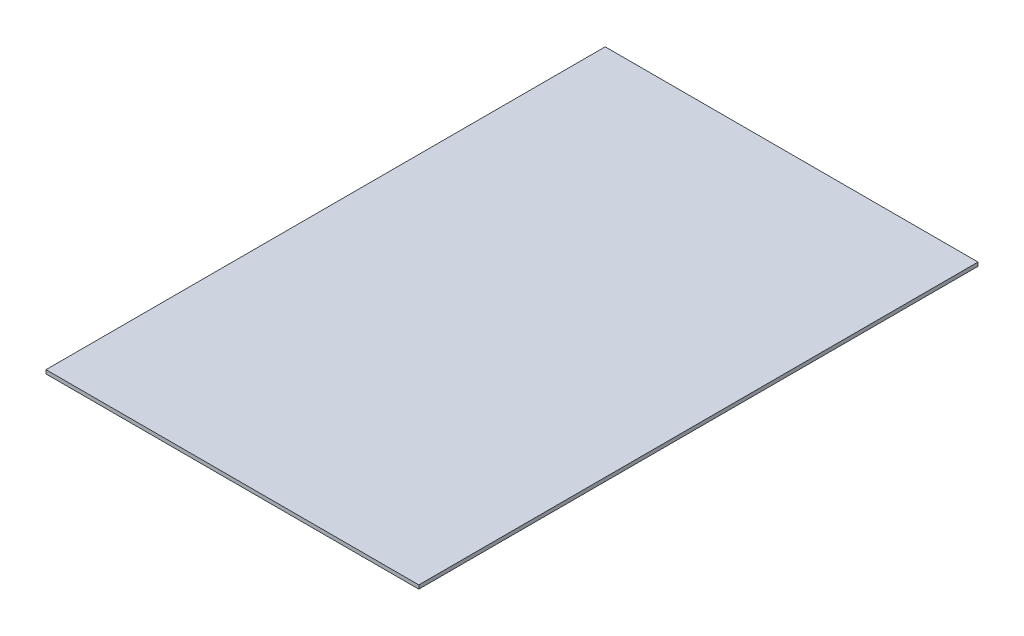
ISO-10303-21;
HEADER;
FILE_DESCRIPTION(('STEP AP214'),'2;1');
FILE_NAME('part.step','',(''),(''),'','','');
FILE_SCHEMA(('AUTOMOTIVE_DESIGN { 1 0 10303 214 1 1 1 1 }'));
ENDSEC;
DATA;
#1=APPLICATION_CONTEXT('core data for automotive mechanical design processes');
#2=APPLICATION_PROTOCOL_DEFINITION('international standard','automotive_design',2000,#1);
#3=PRODUCT_CONTEXT('',#1,'mechanical');
#4=PRODUCT('Part','Part','',(#3));
#5=PRODUCT_RELATED_PRODUCT_CATEGORY('part','',(#4));
#6=PRODUCT_DEFINITION_FORMATION('','',#4);
#7=PRODUCT_DEFINITION_CONTEXT('part definition',#1,'design');
#8=PRODUCT_DEFINITION('design','',#6,#7);
#9=PRODUCT_DEFINITION_SHAPE('','',#8);
#10=(LENGTH_UNIT() NAMED_UNIT(*) SI_UNIT(.MILLI.,.METRE.));
#11=(NAMED_UNIT(*) PLANE_ANGLE_UNIT() SI_UNIT($,.RADIAN.));
#12=(NAMED_UNIT(*) SI_UNIT($,.STERADIAN.) SOLID_ANGLE_UNIT());
#13=UNCERTAINTY_MEASURE_WITH_UNIT(LENGTH_MEASURE(1.E-05),#10,'distance_accuracy_value','');
#14=(GEOMETRIC_REPRESENTATION_CONTEXT(3) GLOBAL_UNCERTAINTY_ASSIGNED_CONTEXT((#13)) GLOBAL_UNIT_ASSIGNED_CONTEXT((#10,
#11,#12)) REPRESENTATION_CONTEXT('',''));
#15=CARTESIAN_POINT('',(0.,0.,0.));
#16=DIRECTION('',(0.,0.,1.));
#17=DIRECTION('',(1.,0.,0.));
#18=AXIS2_PLACEMENT_3D('',#15,#16,#17);
#19=CARTESIAN_POINT('',(127.,2.54,-190.5));
#20=DIRECTION('',(-1.,0.,0.));
#21=DIRECTION('',(0.,0.,1.));
#22=AXIS2_PLACEMENT_3D('',#19,#20,#21);
#23=PLANE('',#22);
#24=DIRECTION('',(0.,0.,-1.));
#25=VECTOR('',#24,1.);
#26=CARTESIAN_POINT('',(127.,0.,-190.5));
#27=LINE('',#26,#25);
#28=CARTESIAN_POINT('',(127.,0.,190.5));
#29=VERTEX_POINT('',#28);
#30=CARTESIAN_POINT('',(127.,0.,-190.5));
#31=VERTEX_POINT('',#30);
#32=EDGE_CURVE('E116',#29,#31,#27,.T.);
#33=ORIENTED_EDGE('',*,*,#32,.T.);
#34=DIRECTION('',(0.,-1.,0.));
#35=VECTOR('',#34,1.);
#36=CARTESIAN_POINT('',(127.,2.54,-190.5));
#37=LINE('',#36,#35);
#38=CARTESIAN_POINT('',(127.,2.54,-190.5));
#39=VERTEX_POINT('',#38);
#40=EDGE_CURVE('E11',#39,#31,#37,.T.);
#41=ORIENTED_EDGE('',*,*,#40,.F.);
#42=DIRECTION('',(0.,0.,-1.));
#43=VECTOR('',#42,1.);
#44=CARTESIAN_POINT('',(127.,2.54,-190.5));
#45=LINE('',#44,#43);
#46=CARTESIAN_POINT('',(127.,2.54,190.5));
#47=VERTEX_POINT('',#46);
#48=EDGE_CURVE('E99',#47,#39,#45,.T.);
#49=ORIENTED_EDGE('',*,*,#48,.F.);
#50=DIRECTION('',(0.,-1.,0.));
#51=VECTOR('',#50,1.);
#52=CARTESIAN_POINT('',(127.,2.54,190.5));
#53=LINE('',#52,#51);
#54=EDGE_CURVE('E112',#47,#29,#53,.T.);
#55=ORIENTED_EDGE('',*,*,#54,.T.);
#56=EDGE_LOOP('',(#33,#41,#49,#55));
#57=FACE_BOUND('',#56,.T.);
#58=ADVANCED_FACE('F47',(#57),#23,.F.);
#59=CARTESIAN_POINT('',(-127.,2.54,-190.5));
#60=DIRECTION('',(0.,0.,1.));
#61=DIRECTION('',(1.,0.,0.));
#62=AXIS2_PLACEMENT_3D('',#59,#60,#61);
#63=PLANE('',#62);
#64=DIRECTION('',(-1.,0.,0.));
#65=VECTOR('',#64,1.);
#66=CARTESIAN_POINT('',(-127.,0.,-190.5));
#67=LINE('',#66,#65);
#68=CARTESIAN_POINT('',(-127.,0.,-190.5));
#69=VERTEX_POINT('',#68);
#70=EDGE_CURVE('E104',#31,#69,#67,.T.);
#71=ORIENTED_EDGE('',*,*,#70,.T.);
#72=DIRECTION('',(0.,-1.,0.));
#73=VECTOR('',#72,1.);
#74=CARTESIAN_POINT('',(-127.,2.54,-190.5));
#75=LINE('',#74,#73);
#76=CARTESIAN_POINT('',(-127.,2.54,-190.5));
#77=VERTEX_POINT('',#76);
#78=EDGE_CURVE('E56',#77,#69,#75,.T.);
#79=ORIENTED_EDGE('',*,*,#78,.F.);
#80=DIRECTION('',(-1.,0.,0.));
#81=VECTOR('',#80,1.);
#82=CARTESIAN_POINT('',(-127.,2.54,-190.5));
#83=LINE('',#82,#81);
#84=EDGE_CURVE('E94',#39,#77,#83,.T.);
#85=ORIENTED_EDGE('',*,*,#84,.F.);
#86=ORIENTED_EDGE('',*,*,#40,.T.);
#87=EDGE_LOOP('',(#71,#79,#85,#86));
#88=FACE_BOUND('',#87,.T.);
#89=ADVANCED_FACE('F103',(#88),#63,.F.);
#90=CARTESIAN_POINT('',(-127.,2.54,-190.5));
#91=DIRECTION('',(1.,0.,0.));
#92=DIRECTION('',(0.,0.,-1.));
#93=AXIS2_PLACEMENT_3D('',#90,#91,#92);
#94=PLANE('',#93);
#95=DIRECTION('',(0.,0.,1.));
#96=VECTOR('',#95,1.);
#97=CARTESIAN_POINT('',(-127.,0.,-190.5));
#98=LINE('',#97,#96);
#99=CARTESIAN_POINT('',(-127.,0.,190.5));
#100=VERTEX_POINT('',#99);
#101=EDGE_CURVE('E81',#69,#100,#98,.T.);
#102=ORIENTED_EDGE('',*,*,#101,.T.);
#103=DIRECTION('',(0.,-1.,0.));
#104=VECTOR('',#103,1.);
#105=CARTESIAN_POINT('',(-127.,2.54,190.5));
#106=LINE('',#105,#104);
#107=CARTESIAN_POINT('',(-127.,2.54,190.5));
#108=VERTEX_POINT('',#107);
#109=EDGE_CURVE('E106',#108,#100,#106,.T.);
#110=ORIENTED_EDGE('',*,*,#109,.F.);
#111=DIRECTION('',(0.,0.,1.));
#112=VECTOR('',#111,1.);
#113=CARTESIAN_POINT('',(-127.,2.54,-190.5));
#114=LINE('',#113,#112);
#115=EDGE_CURVE('E97',#77,#108,#114,.T.);
#116=ORIENTED_EDGE('',*,*,#115,.F.);
#117=ORIENTED_EDGE('',*,*,#78,.T.);
#118=EDGE_LOOP('',(#102,#110,#116,#117));
#119=FACE_BOUND('',#118,.T.);
#120=ADVANCED_FACE('F107',(#119),#94,.F.);
#121=CARTESIAN_POINT('',(-127.,2.54,190.5));
#122=DIRECTION('',(0.,0.,-1.));
#123=DIRECTION('',(-1.,0.,0.));
#124=AXIS2_PLACEMENT_3D('',#121,#122,#123);
#125=PLANE('',#124);
#126=DIRECTION('',(1.,0.,0.));
#127=VECTOR('',#126,1.);
#128=CARTESIAN_POINT('',(-127.,0.,190.5));
#129=LINE('',#128,#127);
#130=EDGE_CURVE('E87',#100,#29,#129,.T.);
#131=ORIENTED_EDGE('',*,*,#130,.T.);
#132=ORIENTED_EDGE('',*,*,#54,.F.);
#133=DIRECTION('',(1.,0.,0.));
#134=VECTOR('',#133,1.);
#135=CARTESIAN_POINT('',(-127.,2.54,190.5));
#136=LINE('',#135,#134);
#137=EDGE_CURVE('E64',#108,#47,#136,.T.);
#138=ORIENTED_EDGE('',*,*,#137,.F.);
#139=ORIENTED_EDGE('',*,*,#109,.T.);
#140=EDGE_LOOP('',(#131,#132,#138,#139));
#141=FACE_BOUND('',#140,.T.);
#142=ADVANCED_FACE('F130',(#141),#125,.F.);
#143=CARTESIAN_POINT('',(0.,2.54,0.));
#144=DIRECTION('',(0.,1.,0.));
#145=DIRECTION('',(0.,0.,1.));
#146=AXIS2_PLACEMENT_3D('',#143,#144,#145);
#147=PLANE('',#146);
#148=ORIENTED_EDGE('',*,*,#48,.T.);
#149=ORIENTED_EDGE('',*,*,#84,.T.);
#150=ORIENTED_EDGE('',*,*,#115,.T.);
#151=ORIENTED_EDGE('',*,*,#137,.T.);
#152=EDGE_LOOP('',(#148,#149,#150,#151));
#153=FACE_BOUND('',#152,.T.);
#154=ADVANCED_FACE('F95',(#153),#147,.T.);
#155=CARTESIAN_POINT('',(0.,0.,0.));
#156=DIRECTION('',(0.,1.,0.));
#157=DIRECTION('',(0.,0.,1.));
#158=AXIS2_PLACEMENT_3D('',#155,#156,#157);
#159=PLANE('',#158);
#160=ORIENTED_EDGE('',*,*,#32,.F.);
#161=ORIENTED_EDGE('',*,*,#130,.F.);
#162=ORIENTED_EDGE('',*,*,#101,.F.);
#163=ORIENTED_EDGE('',*,*,#70,.F.);
#164=EDGE_LOOP('',(#160,#161,#162,#163));
#165=FACE_BOUND('',#164,.T.);
#166=ADVANCED_FACE('F133',(#165),#159,.F.);
#167=CLOSED_SHELL('',(#58,#89,#120,#142,#154,#166));
#168=MANIFOLD_SOLID_BREP('B2',#167);
#169=ADVANCED_BREP_SHAPE_REPRESENTATION('',(#18,#168),#14);
#170=SHAPE_DEFINITION_REPRESENTATION(#9,#169);
ENDSEC;
END-ISO-10303-21;
